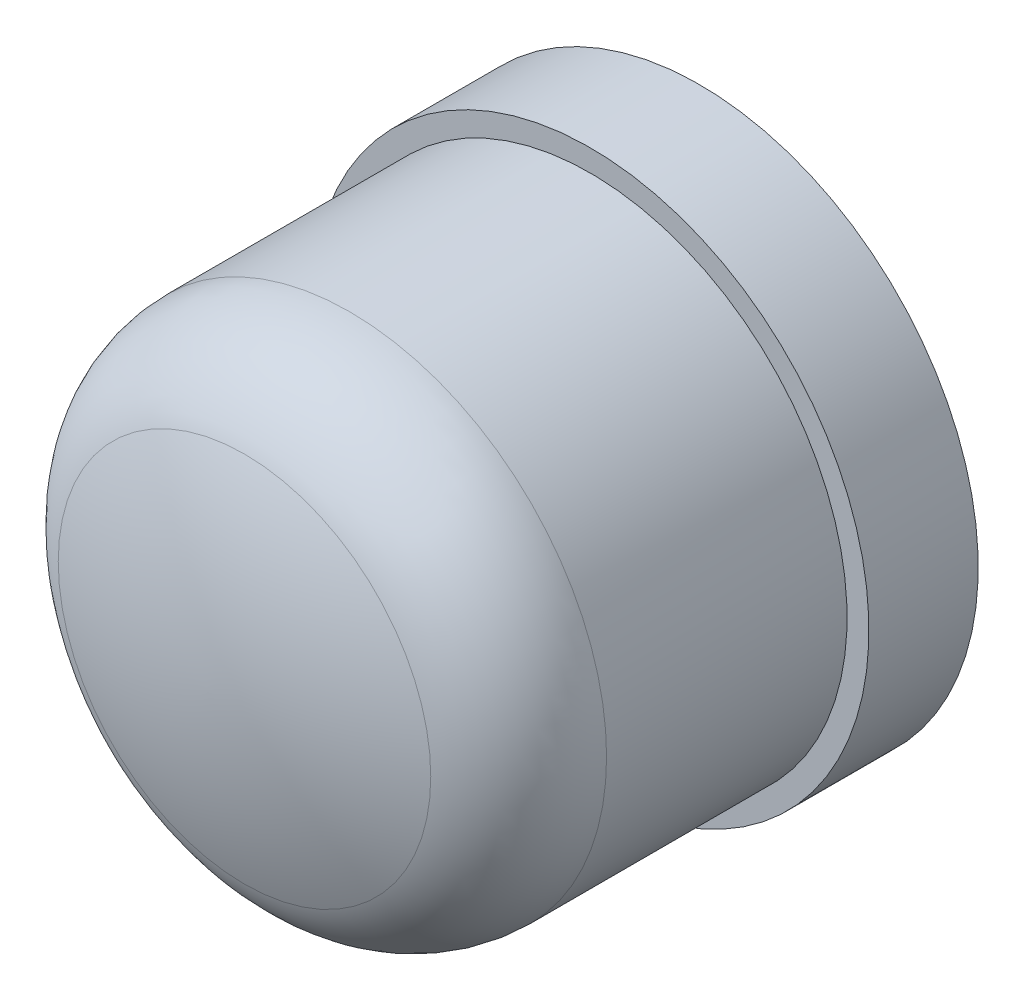
ISO-10303-21;
HEADER;
FILE_DESCRIPTION(('STEP AP214'),'2;1');
FILE_NAME('part.step','',(''),(''),'','','');
FILE_SCHEMA(('AUTOMOTIVE_DESIGN { 1 0 10303 214 1 1 1 1 }'));
ENDSEC;
DATA;
#1=APPLICATION_CONTEXT('core data for automotive mechanical design processes');
#2=APPLICATION_PROTOCOL_DEFINITION('international standard','automotive_design',2000,#1);
#3=PRODUCT_CONTEXT('',#1,'mechanical');
#4=PRODUCT('Part','Part','',(#3));
#5=PRODUCT_RELATED_PRODUCT_CATEGORY('part','',(#4));
#6=PRODUCT_DEFINITION_FORMATION('','',#4);
#7=PRODUCT_DEFINITION_CONTEXT('part definition',#1,'design');
#8=PRODUCT_DEFINITION('design','',#6,#7);
#9=PRODUCT_DEFINITION_SHAPE('','',#8);
#10=(LENGTH_UNIT() NAMED_UNIT(*) SI_UNIT(.MILLI.,.METRE.));
#11=(NAMED_UNIT(*) PLANE_ANGLE_UNIT() SI_UNIT($,.RADIAN.));
#12=(NAMED_UNIT(*) SI_UNIT($,.STERADIAN.) SOLID_ANGLE_UNIT());
#13=UNCERTAINTY_MEASURE_WITH_UNIT(LENGTH_MEASURE(1.E-05),#10,'distance_accuracy_value','');
#14=(GEOMETRIC_REPRESENTATION_CONTEXT(3) GLOBAL_UNCERTAINTY_ASSIGNED_CONTEXT((#13)) GLOBAL_UNIT_ASSIGNED_CONTEXT((#10,
#11,#12)) REPRESENTATION_CONTEXT('',''));
#15=CARTESIAN_POINT('',(0.,0.,0.));
#16=DIRECTION('',(0.,0.,1.));
#17=DIRECTION('',(1.,0.,0.));
#18=AXIS2_PLACEMENT_3D('',#15,#16,#17);
#19=CARTESIAN_POINT('',(-1.5,6.6,15.));
#20=DIRECTION('',(-0.965925826289068,-0.258819045102521,0.));
#21=DIRECTION('',(0.258819045102521,-0.965925826289068,0.));
#22=AXIS2_PLACEMENT_3D('',#19,#20,#21);
#23=PLANE('',#22);
#24=DIRECTION('',(0.258819045102522,-0.965925826289068,0.));
#25=VECTOR('',#24,1.);
#26=CARTESIAN_POINT('',(-1.77135912865659,7.61272605524401,18.052));
#27=LINE('',#26,#25);
#28=CARTESIAN_POINT('',(-1.77135912865659,7.61272605524403,18.052));
#29=VERTEX_POINT('',#28);
#30=CARTESIAN_POINT('',(-1.5,6.6,18.052));
#31=VERTEX_POINT('',#30);
#32=EDGE_CURVE('E180',#29,#31,#27,.T.);
#33=ORIENTED_EDGE('',*,*,#32,.F.);
#34=CARTESIAN_POINT('',(-1.77135912865659,7.61272605524402,18.052));
#35=CARTESIAN_POINT('',(-1.78165605255418,7.65115469839147,17.9774722644857));
#36=CARTESIAN_POINT('',(-1.79113368822193,7.68652571623915,17.9012562079374));
#37=CARTESIAN_POINT('',(-1.80839573763305,7.75094856168421,17.7459755105047));
#38=CARTESIAN_POINT('',(-1.81617944246425,7.77999774358538,17.6669096930647));
#39=CARTESIAN_POINT('',(-1.8299591105371,7.8314241649447,17.5068827660216));
#40=CARTESIAN_POINT('',(-1.8359629858953,7.8538309328238,17.4259318241243));
#41=CARTESIAN_POINT('',(-1.84618565847688,7.89198246628738,17.2624059358982));
#42=CARTESIAN_POINT('',(-1.85040535104523,7.90773057334479,17.1798318259373));
#43=CARTESIAN_POINT('',(-1.85673075051802,7.93133728555541,17.0212053201868));
#44=CARTESIAN_POINT('',(-1.85899438538601,7.93978528589257,16.9452464104373));
#45=CARTESIAN_POINT('',(-1.8620138928105,7.95105424101459,16.7929056633513));
#46=CARTESIAN_POINT('',(-1.8627701327098,7.95387656674146,16.7165239336044));
#47=CARTESIAN_POINT('',(-1.86276891714394,7.95387203018792,16.5327119650491));
#48=CARTESIAN_POINT('',(-1.86127197825863,7.94828537821213,16.4252703859632));
#49=CARTESIAN_POINT('',(-1.8553048956463,7.92601592272994,16.2114628765321));
#50=CARTESIAN_POINT('',(-1.85083025084344,7.9093163209798,16.1050988224475));
#51=CARTESIAN_POINT('',(-1.84487869948727,7.88710482893465,16.0000000000239));
#52=B_SPLINE_CURVE_WITH_KNOTS('',3,(#34,#35,#36,#37,#38,#39,#40,#41,#42,#43,#44,#45,#46,#47,#48,
#49,#50,#51),.UNSPECIFIED.,.F.,.F.,(4,2,2,2,2,2,2,2,4),(0.,0.253368525451175,0.50684288290093,
0.759172931164672,1.0113762035459,1.24053545645671,1.4696388578486,1.79178704609321,
2.11442330038029),.UNSPECIFIED.);
#53=CARTESIAN_POINT('',(-1.84487869949342,7.88710482895773,16.0000000000213));
#54=VERTEX_POINT('',#53);
#55=EDGE_CURVE('E20',#29,#54,#52,.T.);
#56=ORIENTED_EDGE('',*,*,#55,.T.);
#57=DIRECTION('',(0.,0.,1.));
#58=VECTOR('',#57,1.);
#59=CARTESIAN_POINT('',(-1.8448786994871,7.88710482893413,15.));
#60=LINE('',#59,#58);
#61=CARTESIAN_POINT('',(-1.84487869949342,7.88710482895773,15.));
#62=VERTEX_POINT('',#61);
#63=EDGE_CURVE('E158',#54,#62,#60,.F.);
#64=ORIENTED_EDGE('',*,*,#63,.T.);
#65=DIRECTION('',(0.258819045102521,-0.965925826289068,0.));
#66=VECTOR('',#65,1.);
#67=CARTESIAN_POINT('',(-1.5,6.6,15.));
#68=LINE('',#67,#66);
#69=CARTESIAN_POINT('',(-1.5,6.6,15.));
#70=VERTEX_POINT('',#69);
#71=EDGE_CURVE('E168',#62,#70,#68,.T.);
#72=ORIENTED_EDGE('',*,*,#71,.T.);
#73=DIRECTION('',(0.,0.,-1.));
#74=VECTOR('',#73,1.);
#75=CARTESIAN_POINT('',(-1.5,6.6,15.));
#76=LINE('',#75,#74);
#77=EDGE_CURVE('E517',#31,#70,#76,.T.);
#78=ORIENTED_EDGE('',*,*,#77,.F.);
#79=EDGE_LOOP('',(#33,#56,#64,#72,#78));
#80=FACE_BOUND('',#79,.T.);
#81=ADVANCED_FACE('F16',(#80),#23,.T.);
#82=CARTESIAN_POINT('',(2.30384757729337,9.6,15.));
#83=DIRECTION('',(0.965925826289068,-0.258819045102521,0.));
#84=DIRECTION('',(0.258819045102521,0.965925826289068,0.));
#85=AXIS2_PLACEMENT_3D('',#82,#83,#84);
#86=PLANE('',#85);
#87=DIRECTION('',(0.,0.,-1.));
#88=VECTOR('',#87,1.);
#89=CARTESIAN_POINT('',(1.5,6.6,15.));
#90=LINE('',#89,#88);
#91=CARTESIAN_POINT('',(1.5,6.6,15.));
#92=VERTEX_POINT('',#91);
#93=CARTESIAN_POINT('',(1.5,6.6,18.052));
#94=VERTEX_POINT('',#93);
#95=EDGE_CURVE('E520',#92,#94,#90,.F.);
#96=ORIENTED_EDGE('',*,*,#95,.F.);
#97=DIRECTION('',(0.258819045102521,0.965925826289068,0.));
#98=VECTOR('',#97,1.);
#99=CARTESIAN_POINT('',(2.30384757729337,9.6,15.));
#100=LINE('',#99,#98);
#101=CARTESIAN_POINT('',(1.84487869949975,7.88710482898134,15.));
#102=VERTEX_POINT('',#101);
#103=EDGE_CURVE('E528',#92,#102,#100,.T.);
#104=ORIENTED_EDGE('',*,*,#103,.T.);
#105=DIRECTION('',(0.,0.,1.));
#106=VECTOR('',#105,1.);
#107=CARTESIAN_POINT('',(1.84487869949975,7.88710482898134,15.));
#108=LINE('',#107,#106);
#109=CARTESIAN_POINT('',(1.84487869949349,7.88710482895799,16.0000000000226));
#110=VERTEX_POINT('',#109);
#111=EDGE_CURVE('E182',#102,#110,#108,.T.);
#112=ORIENTED_EDGE('',*,*,#111,.T.);
#113=CARTESIAN_POINT('',(1.84487869948724,7.88710482893465,16.0000000000239));
#114=CARTESIAN_POINT('',(1.85081788201614,7.90927015988792,16.1049479226685));
#115=CARTESIAN_POINT('',(1.85528765578418,7.92595158268859,16.2110912734846));
#116=CARTESIAN_POINT('',(1.86126709153423,7.94826714070837,16.424850545869));
#117=CARTESIAN_POINT('',(1.8627702641768,7.95387705738298,16.5324691783047));
#118=CARTESIAN_POINT('',(1.86276863053825,7.95387096056094,16.8087216999609));
#119=CARTESIAN_POINT('',(1.8590800501704,7.94010499122032,16.9774177244521));
#120=CARTESIAN_POINT('',(1.84441641157109,7.88537954694384,17.3099373151076));
#121=CARTESIAN_POINT('',(1.8334459382706,7.84443718320336,17.4737638794823));
#122=CARTESIAN_POINT('',(1.8124633829864,7.76612922081008,17.704903006199));
#123=CARTESIAN_POINT('',(1.80519750127964,7.73901258111869,17.776080305741));
#124=CARTESIAN_POINT('',(1.78929554222692,7.67966566199406,17.9159493810354));
#125=CARTESIAN_POINT('',(1.78066211825283,7.64744528507947,17.9846456599771));
#126=CARTESIAN_POINT('',(1.7713591286566,7.61272605524403,18.052));
#127=B_SPLINE_CURVE_WITH_KNOTS('',3,(#113,#114,#115,#116,#117,#118,#119,#120,#121,#122,#123,
#124,#125,#126),.UNSPECIFIED.,.F.,.F.,(4,2,2,2,2,2,4),(0.,0.322040383444045,0.644784441930393,
1.15018160192491,1.65526084790118,1.88461227576194,2.11352403602894),.UNSPECIFIED.);
#128=CARTESIAN_POINT('',(1.77135912865659,7.61272605524403,18.052));
#129=VERTEX_POINT('',#128);
#130=EDGE_CURVE('E184',#110,#129,#127,.T.);
#131=ORIENTED_EDGE('',*,*,#130,.T.);
#132=DIRECTION('',(0.258819045102522,0.965925826289068,0.));
#133=VECTOR('',#132,1.);
#134=CARTESIAN_POINT('',(1.5,6.6,18.052));
#135=LINE('',#134,#133);
#136=EDGE_CURVE('E538',#94,#129,#135,.T.);
#137=ORIENTED_EDGE('',*,*,#136,.F.);
#138=EDGE_LOOP('',(#96,#104,#112,#131,#137));
#139=FACE_BOUND('',#138,.T.);
#140=ADVANCED_FACE('F536',(#139),#86,.T.);
#141=CARTESIAN_POINT('',(0.,8.27450475901578,18.052));
#142=DIRECTION('',(0.,0.,1.));
#143=DIRECTION('',(1.,0.,0.));
#144=AXIS2_PLACEMENT_3D('',#141,#142,#143);
#145=PLANE('',#144);
#146=DIRECTION('',(1.,0.,0.));
#147=VECTOR('',#146,1.);
#148=CARTESIAN_POINT('',(0.,6.6,18.052));
#149=LINE('',#148,#147);
#150=EDGE_CURVE('E426',#94,#31,#149,.F.);
#151=ORIENTED_EDGE('',*,*,#150,.F.);
#152=ORIENTED_EDGE('',*,*,#136,.T.);
#153=CARTESIAN_POINT('',(0.,0.,18.052));
#154=DIRECTION('',(0.,0.,1.));
#155=DIRECTION('',(1.,0.,0.));
#156=AXIS2_PLACEMENT_3D('',#153,#154,#155);
#157=CIRCLE('',#156,7.8160930876536);
#158=EDGE_CURVE('E304',#129,#29,#157,.T.);
#159=ORIENTED_EDGE('',*,*,#158,.T.);
#160=ORIENTED_EDGE('',*,*,#32,.T.);
#161=EDGE_LOOP('',(#151,#152,#159,#160));
#162=FACE_BOUND('',#161,.T.);
#163=ADVANCED_FACE('F331',(#162),#145,.T.);
#164=CARTESIAN_POINT('',(6.6,1.5,15.));
#165=DIRECTION('',(-0.258819045102521,0.965925826289068,0.));
#166=DIRECTION('',(-0.965925826289068,-0.258819045102521,0.));
#167=AXIS2_PLACEMENT_3D('',#164,#165,#166);
#168=PLANE('',#167);
#169=CARTESIAN_POINT('',(7.61272605524402,1.77135912865659,18.052));
#170=CARTESIAN_POINT('',(7.65115469839147,1.78165605255418,17.9774722644857));
#171=CARTESIAN_POINT('',(7.68652571623915,1.79113368822193,17.9012562079375));
#172=CARTESIAN_POINT('',(7.75094856168421,1.80839573763305,17.7459755105047));
#173=CARTESIAN_POINT('',(7.77999774358538,1.81617944246425,17.6669096930647));
#174=CARTESIAN_POINT('',(7.8314241649447,1.8299591105371,17.5068827660216));
#175=CARTESIAN_POINT('',(7.8538309328238,1.8359629858953,17.4259318241243));
#176=CARTESIAN_POINT('',(7.89198246628738,1.84618565847687,17.2624059358982));
#177=CARTESIAN_POINT('',(7.9077305733448,1.85040535104523,17.1798318259373));
#178=CARTESIAN_POINT('',(7.93133728555541,1.85673075051802,17.0212053201868));
#179=CARTESIAN_POINT('',(7.93978528589256,1.85899438538601,16.9452464104373));
#180=CARTESIAN_POINT('',(7.95105424101459,1.8620138928105,16.7929056633513));
#181=CARTESIAN_POINT('',(7.95387656674146,1.8627701327098,16.7165239336044));
#182=CARTESIAN_POINT('',(7.95387203018792,1.86276891714394,16.5327119650491));
#183=CARTESIAN_POINT('',(7.94828537821213,1.86127197825863,16.4252703859632));
#184=CARTESIAN_POINT('',(7.92601592272994,1.8553048956463,16.2114628765321));
#185=CARTESIAN_POINT('',(7.9093163209798,1.85083025084344,16.1050988224475));
#186=CARTESIAN_POINT('',(7.88710482893465,1.84487869948727,16.0000000000239));
#187=B_SPLINE_CURVE_WITH_KNOTS('',3,(#169,#170,#171,#172,#173,#174,#175,#176,#177,#178,#179,
#180,#181,#182,#183,#184,#185,#186),.UNSPECIFIED.,.F.,.F.,(4,2,2,2,2,2,2,2,4),(0.,
0.253368525451172,0.50684288290093,0.759172931164676,1.0113762035459,1.24053545645671,
1.4696388578486,1.79178704609322,2.11442330038029),.UNSPECIFIED.);
#188=CARTESIAN_POINT('',(7.61272605524402,1.77135912865659,18.052));
#189=VERTEX_POINT('',#188);
#190=CARTESIAN_POINT('',(7.88710482895773,1.84487869949342,16.0000000000213));
#191=VERTEX_POINT('',#190);
#192=EDGE_CURVE('E334',#189,#191,#187,.T.);
#193=ORIENTED_EDGE('',*,*,#192,.T.);
#194=DIRECTION('',(0.,0.,1.));
#195=VECTOR('',#194,1.);
#196=CARTESIAN_POINT('',(7.88710482893413,1.8448786994871,15.));
#197=LINE('',#196,#195);
#198=CARTESIAN_POINT('',(7.88710482895773,1.84487869949342,15.));
#199=VERTEX_POINT('',#198);
#200=EDGE_CURVE('E512',#191,#199,#197,.F.);
#201=ORIENTED_EDGE('',*,*,#200,.T.);
#202=DIRECTION('',(-0.965925826289068,-0.258819045102521,0.));
#203=VECTOR('',#202,1.);
#204=CARTESIAN_POINT('',(6.6,1.5,15.));
#205=LINE('',#204,#203);
#206=CARTESIAN_POINT('',(6.6,1.5,15.));
#207=VERTEX_POINT('',#206);
#208=EDGE_CURVE('E510',#199,#207,#205,.T.);
#209=ORIENTED_EDGE('',*,*,#208,.T.);
#210=DIRECTION('',(0.,0.,1.));
#211=VECTOR('',#210,1.);
#212=CARTESIAN_POINT('',(6.6,1.5,15.));
#213=LINE('',#212,#211);
#214=CARTESIAN_POINT('',(6.6,1.5,18.052));
#215=VERTEX_POINT('',#214);
#216=EDGE_CURVE('E460',#215,#207,#213,.F.);
#217=ORIENTED_EDGE('',*,*,#216,.F.);
#218=DIRECTION('',(-0.965925826289068,-0.258819045102522,0.));
#219=VECTOR('',#218,1.);
#220=CARTESIAN_POINT('',(7.61272605524401,1.77135912865659,18.052));
#221=LINE('',#220,#219);
#222=EDGE_CURVE('E566',#189,#215,#221,.T.);
#223=ORIENTED_EDGE('',*,*,#222,.F.);
#224=EDGE_LOOP('',(#193,#201,#209,#217,#223));
#225=FACE_BOUND('',#224,.T.);
#226=ADVANCED_FACE('F326',(#225),#168,.T.);
#227=CARTESIAN_POINT('',(9.6,-2.30384757729337,15.));
#228=DIRECTION('',(-0.258819045102521,-0.965925826289068,0.));
#229=DIRECTION('',(0.965925826289068,-0.258819045102521,0.));
#230=AXIS2_PLACEMENT_3D('',#227,#228,#229);
#231=PLANE('',#230);
#232=DIRECTION('',(0.,0.,1.));
#233=VECTOR('',#232,1.);
#234=CARTESIAN_POINT('',(6.6,-1.5,15.));
#235=LINE('',#234,#233);
#236=CARTESIAN_POINT('',(6.6,-1.5,15.));
#237=VERTEX_POINT('',#236);
#238=CARTESIAN_POINT('',(6.6,-1.5,18.052));
#239=VERTEX_POINT('',#238);
#240=EDGE_CURVE('E463',#237,#239,#235,.T.);
#241=ORIENTED_EDGE('',*,*,#240,.F.);
#242=DIRECTION('',(0.965925826289068,-0.258819045102521,0.));
#243=VECTOR('',#242,1.);
#244=CARTESIAN_POINT('',(9.6,-2.30384757729337,15.));
#245=LINE('',#244,#243);
#246=CARTESIAN_POINT('',(7.88710482898134,-1.84487869949975,15.));
#247=VERTEX_POINT('',#246);
#248=EDGE_CURVE('E317',#237,#247,#245,.T.);
#249=ORIENTED_EDGE('',*,*,#248,.T.);
#250=DIRECTION('',(0.,0.,1.));
#251=VECTOR('',#250,1.);
#252=CARTESIAN_POINT('',(7.88710482898134,-1.84487869949975,15.));
#253=LINE('',#252,#251);
#254=CARTESIAN_POINT('',(7.88710482895799,-1.8448786994935,16.0000000000226));
#255=VERTEX_POINT('',#254);
#256=EDGE_CURVE('E318',#247,#255,#253,.T.);
#257=ORIENTED_EDGE('',*,*,#256,.T.);
#258=CARTESIAN_POINT('',(7.88710482893465,-1.84487869948724,16.0000000000239));
#259=CARTESIAN_POINT('',(7.90927015988792,-1.85081788201613,16.1049479226685));
#260=CARTESIAN_POINT('',(7.9259515826886,-1.85528765578418,16.2110912734846));
#261=CARTESIAN_POINT('',(7.94826714070837,-1.86126709153423,16.424850545869));
#262=CARTESIAN_POINT('',(7.95387705738298,-1.8627702641768,16.5324691783047));
#263=CARTESIAN_POINT('',(7.95387096056094,-1.86276863053826,16.8087216999609));
#264=CARTESIAN_POINT('',(7.94010499122032,-1.8590800501704,16.9774177244521));
#265=CARTESIAN_POINT('',(7.88537954694384,-1.84441641157109,17.3099373151076));
#266=CARTESIAN_POINT('',(7.84443718320336,-1.83344593827061,17.4737638794823));
#267=CARTESIAN_POINT('',(7.76612922081008,-1.8124633829864,17.704903006199));
#268=CARTESIAN_POINT('',(7.73901258111869,-1.80519750127965,17.776080305741));
#269=CARTESIAN_POINT('',(7.67966566199406,-1.78929554222692,17.9159493810354));
#270=CARTESIAN_POINT('',(7.64744528507947,-1.78066211825283,17.9846456599771));
#271=CARTESIAN_POINT('',(7.61272605524403,-1.77135912865659,18.052));
#272=B_SPLINE_CURVE_WITH_KNOTS('',3,(#258,#259,#260,#261,#262,#263,#264,#265,#266,#267,#268,
#269,#270,#271),.UNSPECIFIED.,.F.,.F.,(4,2,2,2,2,2,4),(0.,0.322040383444045,0.644784441930394,
1.15018160192491,1.65526084790118,1.88461227576194,2.11352403602894),.UNSPECIFIED.);
#273=CARTESIAN_POINT('',(7.61272605524403,-1.77135912865659,18.052));
#274=VERTEX_POINT('',#273);
#275=EDGE_CURVE('E313',#255,#274,#272,.T.);
#276=ORIENTED_EDGE('',*,*,#275,.T.);
#277=DIRECTION('',(0.965925826289068,-0.258819045102522,0.));
#278=VECTOR('',#277,1.);
#279=CARTESIAN_POINT('',(6.6,-1.5,18.052));
#280=LINE('',#279,#278);
#281=EDGE_CURVE('E265',#239,#274,#280,.T.);
#282=ORIENTED_EDGE('',*,*,#281,.F.);
#283=EDGE_LOOP('',(#241,#249,#257,#276,#282));
#284=FACE_BOUND('',#283,.T.);
#285=ADVANCED_FACE('F322',(#284),#231,.T.);
#286=CARTESIAN_POINT('',(1.5,-6.6,15.));
#287=DIRECTION('',(0.965925826289068,0.258819045102521,0.));
#288=DIRECTION('',(-0.258819045102521,0.965925826289068,0.));
#289=AXIS2_PLACEMENT_3D('',#286,#287,#288);
#290=PLANE('',#289);
#291=DIRECTION('',(-0.258819045102522,0.965925826289068,0.));
#292=VECTOR('',#291,1.);
#293=CARTESIAN_POINT('',(1.77135912865659,-7.61272605524401,18.052));
#294=LINE('',#293,#292);
#295=CARTESIAN_POINT('',(1.7713591286566,-7.61272605524403,18.052));
#296=VERTEX_POINT('',#295);
#297=CARTESIAN_POINT('',(1.5,-6.6,18.052));
#298=VERTEX_POINT('',#297);
#299=EDGE_CURVE('E489',#296,#298,#294,.T.);
#300=ORIENTED_EDGE('',*,*,#299,.F.);
#301=CARTESIAN_POINT('',(1.7713591286566,-7.61272605524402,18.052));
#302=CARTESIAN_POINT('',(1.78165605255418,-7.65115469839147,17.9774722644857));
#303=CARTESIAN_POINT('',(1.79113368822193,-7.68652571623915,17.9012562079374));
#304=CARTESIAN_POINT('',(1.80839573763305,-7.75094856168421,17.7459755105047));
#305=CARTESIAN_POINT('',(1.81617944246425,-7.77999774358538,17.6669096930647));
#306=CARTESIAN_POINT('',(1.8299591105371,-7.8314241649447,17.5068827660216));
#307=CARTESIAN_POINT('',(1.8359629858953,-7.8538309328238,17.4259318241243));
#308=CARTESIAN_POINT('',(1.84618565847687,-7.89198246628738,17.2624059358982));
#309=CARTESIAN_POINT('',(1.85040535104523,-7.9077305733448,17.1798318259373));
#310=CARTESIAN_POINT('',(1.85673075051801,-7.93133728555541,17.0212053201868));
#311=CARTESIAN_POINT('',(1.85899438538601,-7.93978528589256,16.9452464104373));
#312=CARTESIAN_POINT('',(1.8620138928105,-7.95105424101459,16.7929056633513));
#313=CARTESIAN_POINT('',(1.8627701327098,-7.95387656674146,16.7165239336044));
#314=CARTESIAN_POINT('',(1.86276891714394,-7.95387203018792,16.5327119650491));
#315=CARTESIAN_POINT('',(1.86127197825863,-7.94828537821213,16.4252703859632));
#316=CARTESIAN_POINT('',(1.8553048956463,-7.92601592272994,16.2114628765321));
#317=CARTESIAN_POINT('',(1.85083025084344,-7.9093163209798,16.1050988224475));
#318=CARTESIAN_POINT('',(1.84487869948726,-7.88710482893465,16.0000000000239));
#319=B_SPLINE_CURVE_WITH_KNOTS('',3,(#301,#302,#303,#304,#305,#306,#307,#308,#309,#310,#311,
#312,#313,#314,#315,#316,#317,#318),.UNSPECIFIED.,.F.,.F.,(4,2,2,2,2,2,2,2,4),(0.,
0.253368525451174,0.50684288290093,0.759172931164672,1.0113762035459,1.24053545645671,
1.4696388578486,1.79178704609321,2.11442330038029),.UNSPECIFIED.);
#320=CARTESIAN_POINT('',(1.84487869949342,-7.88710482895773,16.0000000000213));
#321=VERTEX_POINT('',#320);
#322=EDGE_CURVE('E306',#296,#321,#319,.T.);
#323=ORIENTED_EDGE('',*,*,#322,.T.);
#324=DIRECTION('',(0.,0.,1.));
#325=VECTOR('',#324,1.);
#326=CARTESIAN_POINT('',(1.8448786994871,-7.88710482893413,15.));
#327=LINE('',#326,#325);
#328=CARTESIAN_POINT('',(1.84487869949342,-7.88710482895773,15.));
#329=VERTEX_POINT('',#328);
#330=EDGE_CURVE('E497',#321,#329,#327,.F.);
#331=ORIENTED_EDGE('',*,*,#330,.T.);
#332=DIRECTION('',(-0.258819045102521,0.965925826289068,0.));
#333=VECTOR('',#332,1.);
#334=CARTESIAN_POINT('',(1.5,-6.6,15.));
#335=LINE('',#334,#333);
#336=CARTESIAN_POINT('',(1.5,-6.6,15.));
#337=VERTEX_POINT('',#336);
#338=EDGE_CURVE('E312',#329,#337,#335,.T.);
#339=ORIENTED_EDGE('',*,*,#338,.T.);
#340=DIRECTION('',(0.,0.,1.));
#341=VECTOR('',#340,1.);
#342=CARTESIAN_POINT('',(1.5,-6.6,15.));
#343=LINE('',#342,#341);
#344=EDGE_CURVE('E475',#298,#337,#343,.F.);
#345=ORIENTED_EDGE('',*,*,#344,.F.);
#346=EDGE_LOOP('',(#300,#323,#331,#339,#345));
#347=FACE_BOUND('',#346,.T.);
#348=ADVANCED_FACE('F291',(#347),#290,.T.);
#349=CARTESIAN_POINT('',(-2.30384757729337,-9.6,15.));
#350=DIRECTION('',(-0.965925826289068,0.258819045102521,0.));
#351=DIRECTION('',(-0.258819045102521,-0.965925826289068,0.));
#352=AXIS2_PLACEMENT_3D('',#349,#350,#351);
#353=PLANE('',#352);
#354=DIRECTION('',(0.,0.,1.));
#355=VECTOR('',#354,1.);
#356=CARTESIAN_POINT('',(-1.5,-6.6,15.));
#357=LINE('',#356,#355);
#358=CARTESIAN_POINT('',(-1.5,-6.6,15.));
#359=VERTEX_POINT('',#358);
#360=CARTESIAN_POINT('',(-1.5,-6.6,18.052));
#361=VERTEX_POINT('',#360);
#362=EDGE_CURVE('E478',#359,#361,#357,.T.);
#363=ORIENTED_EDGE('',*,*,#362,.F.);
#364=DIRECTION('',(-0.258819045102521,-0.965925826289068,0.));
#365=VECTOR('',#364,1.);
#366=CARTESIAN_POINT('',(-2.30384757729337,-9.6,15.));
#367=LINE('',#366,#365);
#368=CARTESIAN_POINT('',(-1.84487869949975,-7.88710482898134,15.));
#369=VERTEX_POINT('',#368);
#370=EDGE_CURVE('E302',#359,#369,#367,.T.);
#371=ORIENTED_EDGE('',*,*,#370,.T.);
#372=DIRECTION('',(0.,0.,1.));
#373=VECTOR('',#372,1.);
#374=CARTESIAN_POINT('',(-1.84487869949975,-7.88710482898134,15.));
#375=LINE('',#374,#373);
#376=CARTESIAN_POINT('',(-1.8448786994935,-7.88710482895799,16.0000000000226));
#377=VERTEX_POINT('',#376);
#378=EDGE_CURVE('E303',#369,#377,#375,.T.);
#379=ORIENTED_EDGE('',*,*,#378,.T.);
#380=CARTESIAN_POINT('',(-1.84487869948724,-7.88710482893465,16.0000000000239));
#381=CARTESIAN_POINT('',(-1.85081788201613,-7.90927015988792,16.1049479226685));
#382=CARTESIAN_POINT('',(-1.85528765578418,-7.9259515826886,16.2110912734846));
#383=CARTESIAN_POINT('',(-1.86126709153423,-7.94826714070837,16.424850545869));
#384=CARTESIAN_POINT('',(-1.8627702641768,-7.95387705738297,16.5324691783047));
#385=CARTESIAN_POINT('',(-1.86276863053826,-7.95387096056094,16.8087216999609));
#386=CARTESIAN_POINT('',(-1.8590800501704,-7.94010499122032,16.9774177244521));
#387=CARTESIAN_POINT('',(-1.84441641157109,-7.88537954694384,17.3099373151076));
#388=CARTESIAN_POINT('',(-1.83344593827061,-7.84443718320336,17.4737638794823));
#389=CARTESIAN_POINT('',(-1.8124633829864,-7.76612922081008,17.704903006199));
#390=CARTESIAN_POINT('',(-1.80519750127964,-7.73901258111869,17.776080305741));
#391=CARTESIAN_POINT('',(-1.78929554222692,-7.67966566199406,17.9159493810354));
#392=CARTESIAN_POINT('',(-1.78066211825283,-7.64744528507947,17.9846456599771));
#393=CARTESIAN_POINT('',(-1.7713591286566,-7.61272605524402,18.052));
#394=B_SPLINE_CURVE_WITH_KNOTS('',3,(#380,#381,#382,#383,#384,#385,#386,#387,#388,#389,#390,
#391,#392,#393),.UNSPECIFIED.,.F.,.F.,(4,2,2,2,2,2,4),(0.,0.322040383444045,0.644784441930393,
1.15018160192491,1.65526084790118,1.88461227576194,2.11352403602894),.UNSPECIFIED.);
#395=CARTESIAN_POINT('',(-1.7713591286566,-7.61272605524403,18.052));
#396=VERTEX_POINT('',#395);
#397=EDGE_CURVE('E296',#377,#396,#394,.T.);
#398=ORIENTED_EDGE('',*,*,#397,.T.);
#399=DIRECTION('',(-0.258819045102522,-0.965925826289068,0.));
#400=VECTOR('',#399,1.);
#401=CARTESIAN_POINT('',(-1.5,-6.6,18.052));
#402=LINE('',#401,#400);
#403=EDGE_CURVE('E561',#361,#396,#402,.T.);
#404=ORIENTED_EDGE('',*,*,#403,.F.);
#405=EDGE_LOOP('',(#363,#371,#379,#398,#404));
#406=FACE_BOUND('',#405,.T.);
#407=ADVANCED_FACE('F286',(#406),#353,.T.);
#408=CARTESIAN_POINT('',(0.,-8.27450475901578,18.052));
#409=DIRECTION('',(0.,0.,1.));
#410=DIRECTION('',(1.,0.,0.));
#411=AXIS2_PLACEMENT_3D('',#408,#409,#410);
#412=PLANE('',#411);
#413=DIRECTION('',(1.,0.,0.));
#414=VECTOR('',#413,1.);
#415=CARTESIAN_POINT('',(0.,-6.6,18.052));
#416=LINE('',#415,#414);
#417=EDGE_CURVE('E466',#361,#298,#416,.T.);
#418=ORIENTED_EDGE('',*,*,#417,.F.);
#419=ORIENTED_EDGE('',*,*,#403,.T.);
#420=CARTESIAN_POINT('',(0.,0.,18.052));
#421=DIRECTION('',(0.,0.,1.));
#422=DIRECTION('',(1.,0.,0.));
#423=AXIS2_PLACEMENT_3D('',#420,#421,#422);
#424=CIRCLE('',#423,7.8160930876536);
#425=EDGE_CURVE('E340',#396,#296,#424,.T.);
#426=ORIENTED_EDGE('',*,*,#425,.T.);
#427=ORIENTED_EDGE('',*,*,#299,.T.);
#428=EDGE_LOOP('',(#418,#419,#426,#427));
#429=FACE_BOUND('',#428,.T.);
#430=ADVANCED_FACE('F282',(#429),#412,.T.);
#431=CARTESIAN_POINT('',(8.27450475901578,0.,18.052));
#432=DIRECTION('',(0.,0.,1.));
#433=DIRECTION('',(1.,0.,0.));
#434=AXIS2_PLACEMENT_3D('',#431,#432,#433);
#435=PLANE('',#434);
#436=ORIENTED_EDGE('',*,*,#281,.T.);
#437=CARTESIAN_POINT('',(0.,0.,18.052));
#438=DIRECTION('',(0.,0.,1.));
#439=DIRECTION('',(1.,0.,0.));
#440=AXIS2_PLACEMENT_3D('',#437,#438,#439);
#441=CIRCLE('',#440,7.8160930876536);
#442=EDGE_CURVE('E269',#274,#189,#441,.T.);
#443=ORIENTED_EDGE('',*,*,#442,.T.);
#444=ORIENTED_EDGE('',*,*,#222,.T.);
#445=DIRECTION('',(0.,1.,0.));
#446=VECTOR('',#445,1.);
#447=CARTESIAN_POINT('',(6.6,0.,18.052));
#448=LINE('',#447,#446);
#449=EDGE_CURVE('E339',#239,#215,#448,.T.);
#450=ORIENTED_EDGE('',*,*,#449,.F.);
#451=EDGE_LOOP('',(#436,#443,#444,#450));
#452=FACE_BOUND('',#451,.T.);
#453=ADVANCED_FACE('F278',(#452),#435,.T.);
#454=CARTESIAN_POINT('',(2.22488760311653,0.,-0.515861620505746));
#455=DIRECTION('',(0.,1.,0.));
#456=DIRECTION('',(1.,0.,0.));
#457=AXIS2_PLACEMENT_3D('',#454,#455,#456);
#458=CIRCLE('',#457,19.9999999999999);
#459=TRIMMED_CURVE('',#458,(PARAMETER_VALUE(-1.68227144153101)),
(PARAMETER_VALUE(1.68227144153101)),.T.,.PARAMETER.);
#460=CARTESIAN_POINT('',(0.,0.,-0.515861620505746));
#461=DIRECTION('',(0.,0.,1.));
#462=AXIS1_PLACEMENT('',#460,#461);
#463=SURFACE_OF_REVOLUTION('',#459,#462);
#464=CARTESIAN_POINT('',(0.,0.,18.8583077251708));
#465=DIRECTION('',(0.,0.,1.));
#466=DIRECTION('',(1.,0.,0.));
#467=AXIS2_PLACEMENT_3D('',#464,#465,#466);
#468=CIRCLE('',#467,7.18891441253554);
#469=CARTESIAN_POINT('',(7.18891441253554,0.,18.8583077251708));
#470=VERTEX_POINT('',#469);
#471=EDGE_CURVE('E266',#470,#470,#468,.F.);
#472=ORIENTED_EDGE('',*,*,#471,.T.);
#473=EDGE_LOOP('',(#472));
#474=FACE_BOUND('',#473,.T.);
#475=CARTESIAN_POINT('',(0.,0.,19.3599999998994));
#476=VERTEX_POINT('',#475);
#477=VERTEX_LOOP('',#476);
#478=FACE_BOUND('',#477,.T.);
#479=ADVANCED_FACE('F274',(#474,#478),#463,.T.);
#480=CARTESIAN_POINT('',(-8.27450475901578,0.,18.052));
#481=DIRECTION('',(0.,0.,1.));
#482=DIRECTION('',(1.,0.,0.));
#483=AXIS2_PLACEMENT_3D('',#480,#481,#482);
#484=PLANE('',#483);
#485=DIRECTION('',(-0.965925826289068,0.258819045102521,0.));
#486=VECTOR('',#485,1.);
#487=CARTESIAN_POINT('',(-9.6,2.30384757729337,18.052));
#488=LINE('',#487,#486);
#489=CARTESIAN_POINT('',(-7.61272605524402,1.77135912865659,18.052));
#490=VERTEX_POINT('',#489);
#491=CARTESIAN_POINT('',(-6.6,1.5,18.052));
#492=VERTEX_POINT('',#491);
#493=EDGE_CURVE('E248',#490,#492,#488,.F.);
#494=ORIENTED_EDGE('',*,*,#493,.F.);
#495=CARTESIAN_POINT('',(0.,0.,18.052));
#496=DIRECTION('',(0.,0.,1.));
#497=DIRECTION('',(1.,0.,0.));
#498=AXIS2_PLACEMENT_3D('',#495,#496,#497);
#499=CIRCLE('',#498,7.8160930876536);
#500=CARTESIAN_POINT('',(-7.61272605524402,-1.77135912865659,18.052));
#501=VERTEX_POINT('',#500);
#502=EDGE_CURVE('E226',#490,#501,#499,.T.);
#503=ORIENTED_EDGE('',*,*,#502,.T.);
#504=DIRECTION('',(0.965925826289068,0.258819045102521,0.));
#505=VECTOR('',#504,1.);
#506=CARTESIAN_POINT('',(-6.6,-1.5,18.052));
#507=LINE('',#506,#505);
#508=CARTESIAN_POINT('',(-6.6,-1.5,18.052));
#509=VERTEX_POINT('',#508);
#510=EDGE_CURVE('E256',#509,#501,#507,.F.);
#511=ORIENTED_EDGE('',*,*,#510,.F.);
#512=DIRECTION('',(0.,1.,0.));
#513=VECTOR('',#512,1.);
#514=CARTESIAN_POINT('',(-6.6,0.,18.052));
#515=LINE('',#514,#513);
#516=EDGE_CURVE('E225',#492,#509,#515,.F.);
#517=ORIENTED_EDGE('',*,*,#516,.F.);
#518=EDGE_LOOP('',(#494,#503,#511,#517));
#519=FACE_BOUND('',#518,.T.);
#520=ADVANCED_FACE('F277',(#519),#484,.T.);
#521=CARTESIAN_POINT('',(-6.6,-1.5,15.));
#522=DIRECTION('',(0.258819045102521,-0.965925826289068,0.));
#523=DIRECTION('',(0.965925826289068,0.258819045102521,0.));
#524=AXIS2_PLACEMENT_3D('',#521,#522,#523);
#525=PLANE('',#524);
#526=CARTESIAN_POINT('',(-7.61272605524402,-1.77135912865659,18.052));
#527=CARTESIAN_POINT('',(-7.65115469839147,-1.78165605255418,17.9774722644857));
#528=CARTESIAN_POINT('',(-7.68652571623915,-1.79113368822193,17.9012562079375));
#529=CARTESIAN_POINT('',(-7.75094856168421,-1.80839573763305,17.7459755105047));
#530=CARTESIAN_POINT('',(-7.77999774358538,-1.81617944246425,17.6669096930647));
#531=CARTESIAN_POINT('',(-7.8314241649447,-1.8299591105371,17.5068827660216));
#532=CARTESIAN_POINT('',(-7.8538309328238,-1.8359629858953,17.4259318241243));
#533=CARTESIAN_POINT('',(-7.89198246628738,-1.84618565847687,17.2624059358982));
#534=CARTESIAN_POINT('',(-7.9077305733448,-1.85040535104523,17.1798318259373));
#535=CARTESIAN_POINT('',(-7.93133728555541,-1.85673075051802,17.0212053201868));
#536=CARTESIAN_POINT('',(-7.93978528589256,-1.85899438538601,16.9452464104373));
#537=CARTESIAN_POINT('',(-7.95105424101459,-1.8620138928105,16.7929056633513));
#538=CARTESIAN_POINT('',(-7.95387656674146,-1.8627701327098,16.7165239336044));
#539=CARTESIAN_POINT('',(-7.95387203018792,-1.86276891714394,16.5327119650491));
#540=CARTESIAN_POINT('',(-7.94828537821213,-1.86127197825863,16.4252703859632));
#541=CARTESIAN_POINT('',(-7.92601592272994,-1.8553048956463,16.2114628765321));
#542=CARTESIAN_POINT('',(-7.9093163209798,-1.85083025084344,16.1050988224475));
#543=CARTESIAN_POINT('',(-7.88710482893465,-1.84487869948727,16.0000000000239));
#544=B_SPLINE_CURVE_WITH_KNOTS('',3,(#526,#527,#528,#529,#530,#531,#532,#533,#534,#535,#536,
#537,#538,#539,#540,#541,#542,#543),.UNSPECIFIED.,.F.,.F.,(4,2,2,2,2,2,2,2,4),(0.,
0.253368525451172,0.50684288290093,0.759172931164676,1.0113762035459,1.24053545645672,
1.4696388578486,1.79178704609322,2.11442330038029),.UNSPECIFIED.);
#545=CARTESIAN_POINT('',(-7.88710482895773,-1.84487869949342,16.0000000000213));
#546=VERTEX_POINT('',#545);
#547=EDGE_CURVE('E219',#501,#546,#544,.T.);
#548=ORIENTED_EDGE('',*,*,#547,.T.);
#549=DIRECTION('',(0.,0.,1.));
#550=VECTOR('',#549,1.);
#551=CARTESIAN_POINT('',(-7.88710482893413,-1.8448786994871,15.));
#552=LINE('',#551,#550);
#553=CARTESIAN_POINT('',(-7.88710482895773,-1.84487869949342,15.));
#554=VERTEX_POINT('',#553);
#555=EDGE_CURVE('E262',#546,#554,#552,.F.);
#556=ORIENTED_EDGE('',*,*,#555,.T.);
#557=DIRECTION('',(0.965925826289068,0.258819045102521,0.));
#558=VECTOR('',#557,1.);
#559=CARTESIAN_POINT('',(-6.6,-1.5,15.));
#560=LINE('',#559,#558);
#561=CARTESIAN_POINT('',(-6.6,-1.5,15.));
#562=VERTEX_POINT('',#561);
#563=EDGE_CURVE('E259',#554,#562,#560,.T.);
#564=ORIENTED_EDGE('',*,*,#563,.T.);
#565=DIRECTION('',(0.,0.,-1.));
#566=VECTOR('',#565,1.);
#567=CARTESIAN_POINT('',(-6.6,-1.5,15.));
#568=LINE('',#567,#566);
#569=EDGE_CURVE('E433',#509,#562,#568,.T.);
#570=ORIENTED_EDGE('',*,*,#569,.F.);
#571=ORIENTED_EDGE('',*,*,#510,.T.);
#572=EDGE_LOOP('',(#548,#556,#564,#570,#571));
#573=FACE_BOUND('',#572,.T.);
#574=ADVANCED_FACE('F228',(#573),#525,.T.);
#575=CARTESIAN_POINT('',(-9.6,2.30384757729337,15.));
#576=DIRECTION('',(0.258819045102521,0.965925826289068,0.));
#577=DIRECTION('',(-0.965925826289068,0.258819045102521,0.));
#578=AXIS2_PLACEMENT_3D('',#575,#576,#577);
#579=PLANE('',#578);
#580=DIRECTION('',(0.,0.,-1.));
#581=VECTOR('',#580,1.);
#582=CARTESIAN_POINT('',(-6.6,1.5,15.));
#583=LINE('',#582,#581);
#584=CARTESIAN_POINT('',(-6.6,1.5,15.));
#585=VERTEX_POINT('',#584);
#586=EDGE_CURVE('E429',#585,#492,#583,.F.);
#587=ORIENTED_EDGE('',*,*,#586,.F.);
#588=DIRECTION('',(-0.965925826289068,0.258819045102521,0.));
#589=VECTOR('',#588,1.);
#590=CARTESIAN_POINT('',(-9.6,2.30384757729337,15.));
#591=LINE('',#590,#589);
#592=CARTESIAN_POINT('',(-7.88710482898134,1.84487869949975,15.));
#593=VERTEX_POINT('',#592);
#594=EDGE_CURVE('E251',#585,#593,#591,.T.);
#595=ORIENTED_EDGE('',*,*,#594,.T.);
#596=DIRECTION('',(0.,0.,1.));
#597=VECTOR('',#596,1.);
#598=CARTESIAN_POINT('',(-7.88710482898134,1.84487869949975,15.));
#599=LINE('',#598,#597);
#600=CARTESIAN_POINT('',(-7.887104828958,1.84487869949349,16.0000000000226));
#601=VERTEX_POINT('',#600);
#602=EDGE_CURVE('E252',#593,#601,#599,.T.);
#603=ORIENTED_EDGE('',*,*,#602,.T.);
#604=CARTESIAN_POINT('',(-7.88710482893465,1.84487869948724,16.0000000000239));
#605=CARTESIAN_POINT('',(-7.90927015988792,1.85081788201613,16.1049479226685));
#606=CARTESIAN_POINT('',(-7.9259515826886,1.85528765578418,16.2110912734846));
#607=CARTESIAN_POINT('',(-7.94826714070837,1.86126709153423,16.424850545869));
#608=CARTESIAN_POINT('',(-7.95387705738298,1.8627702641768,16.5324691783047));
#609=CARTESIAN_POINT('',(-7.95387096056093,1.86276863053826,16.8087216999609));
#610=CARTESIAN_POINT('',(-7.94010499122032,1.8590800501704,16.9774177244521));
#611=CARTESIAN_POINT('',(-7.88537954694384,1.84441641157109,17.3099373151076));
#612=CARTESIAN_POINT('',(-7.84443718320336,1.8334459382706,17.4737638794823));
#613=CARTESIAN_POINT('',(-7.76612922081008,1.8124633829864,17.704903006199));
#614=CARTESIAN_POINT('',(-7.73901258111869,1.80519750127964,17.776080305741));
#615=CARTESIAN_POINT('',(-7.67966566199406,1.78929554222692,17.9159493810354));
#616=CARTESIAN_POINT('',(-7.64744528507947,1.78066211825283,17.9846456599771));
#617=CARTESIAN_POINT('',(-7.61272605524403,1.77135912865659,18.052));
#618=B_SPLINE_CURVE_WITH_KNOTS('',3,(#604,#605,#606,#607,#608,#609,#610,#611,#612,#613,#614,
#615,#616,#617),.UNSPECIFIED.,.F.,.F.,(4,2,2,2,2,2,4),(0.,0.322040383444045,0.644784441930393,
1.15018160192491,1.65526084790118,1.88461227576194,2.11352403602894),.UNSPECIFIED.);
#619=EDGE_CURVE('E176',#601,#490,#618,.T.);
#620=ORIENTED_EDGE('',*,*,#619,.T.);
#621=ORIENTED_EDGE('',*,*,#493,.T.);
#622=EDGE_LOOP('',(#587,#595,#603,#620,#621));
#623=FACE_BOUND('',#622,.T.);
#624=ADVANCED_FACE('F344',(#623),#579,.T.);
#625=CARTESIAN_POINT('',(0.,6.6,15.));
#626=DIRECTION('',(0.,-1.,0.));
#627=DIRECTION('',(0.,0.,-1.));
#628=AXIS2_PLACEMENT_3D('',#625,#626,#627);
#629=PLANE('',#628);
#630=DIRECTION('',(1.,0.,0.));
#631=VECTOR('',#630,1.);
#632=CARTESIAN_POINT('',(0.,6.6,15.));
#633=LINE('',#632,#631);
#634=EDGE_CURVE('E432',#70,#92,#633,.T.);
#635=ORIENTED_EDGE('',*,*,#634,.T.);
#636=ORIENTED_EDGE('',*,*,#95,.T.);
#637=ORIENTED_EDGE('',*,*,#150,.T.);
#638=ORIENTED_EDGE('',*,*,#77,.T.);
#639=EDGE_LOOP('',(#635,#636,#637,#638));
#640=FACE_BOUND('',#639,.T.);
#641=ADVANCED_FACE('F348',(#640),#629,.T.);
#642=CARTESIAN_POINT('',(6.6,0.,15.));
#643=DIRECTION('',(-1.,0.,0.));
#644=DIRECTION('',(0.,0.,1.));
#645=AXIS2_PLACEMENT_3D('',#642,#643,#644);
#646=PLANE('',#645);
#647=DIRECTION('',(0.,1.,0.));
#648=VECTOR('',#647,1.);
#649=CARTESIAN_POINT('',(6.6,0.,15.));
#650=LINE('',#649,#648);
#651=EDGE_CURVE('E440',#207,#237,#650,.F.);
#652=ORIENTED_EDGE('',*,*,#651,.T.);
#653=ORIENTED_EDGE('',*,*,#240,.T.);
#654=ORIENTED_EDGE('',*,*,#449,.T.);
#655=ORIENTED_EDGE('',*,*,#216,.T.);
#656=EDGE_LOOP('',(#652,#653,#654,#655));
#657=FACE_BOUND('',#656,.T.);
#658=ADVANCED_FACE('F352',(#657),#646,.T.);
#659=CARTESIAN_POINT('',(0.,-6.6,15.));
#660=DIRECTION('',(0.,1.,0.));
#661=DIRECTION('',(0.,0.,1.));
#662=AXIS2_PLACEMENT_3D('',#659,#660,#661);
#663=PLANE('',#662);
#664=DIRECTION('',(1.,0.,0.));
#665=VECTOR('',#664,1.);
#666=CARTESIAN_POINT('',(0.,-6.6,15.));
#667=LINE('',#666,#665);
#668=EDGE_CURVE('E437',#337,#359,#667,.F.);
#669=ORIENTED_EDGE('',*,*,#668,.T.);
#670=ORIENTED_EDGE('',*,*,#362,.T.);
#671=ORIENTED_EDGE('',*,*,#417,.T.);
#672=ORIENTED_EDGE('',*,*,#344,.T.);
#673=EDGE_LOOP('',(#669,#670,#671,#672));
#674=FACE_BOUND('',#673,.T.);
#675=ADVANCED_FACE('F356',(#674),#663,.T.);
#676=CARTESIAN_POINT('',(-6.6,0.,15.));
#677=DIRECTION('',(1.,0.,0.));
#678=DIRECTION('',(0.,0.,-1.));
#679=AXIS2_PLACEMENT_3D('',#676,#677,#678);
#680=PLANE('',#679);
#681=DIRECTION('',(0.,1.,0.));
#682=VECTOR('',#681,1.);
#683=CARTESIAN_POINT('',(-6.6,0.,15.));
#684=LINE('',#683,#682);
#685=EDGE_CURVE('E177',#562,#585,#684,.T.);
#686=ORIENTED_EDGE('',*,*,#685,.T.);
#687=ORIENTED_EDGE('',*,*,#586,.T.);
#688=ORIENTED_EDGE('',*,*,#516,.T.);
#689=ORIENTED_EDGE('',*,*,#569,.T.);
#690=EDGE_LOOP('',(#686,#687,#688,#689));
#691=FACE_BOUND('',#690,.T.);
#692=ADVANCED_FACE('F360',(#691),#680,.T.);
#693=CARTESIAN_POINT('',(0.,8.27450475901578,15.));
#694=DIRECTION('',(0.,0.,1.));
#695=DIRECTION('',(1.,0.,0.));
#696=AXIS2_PLACEMENT_3D('',#693,#694,#695);
#697=PLANE('',#696);
#698=ORIENTED_EDGE('',*,*,#103,.F.);
#699=ORIENTED_EDGE('',*,*,#634,.F.);
#700=ORIENTED_EDGE('',*,*,#71,.F.);
#701=CARTESIAN_POINT('',(0.,0.,15.));
#702=DIRECTION('',(0.,0.,-1.));
#703=DIRECTION('',(-1.,0.,0.));
#704=AXIS2_PLACEMENT_3D('',#701,#702,#703);
#705=CIRCLE('',#704,8.09999999995115);
#706=EDGE_CURVE('E165',#62,#102,#705,.T.);
#707=ORIENTED_EDGE('',*,*,#706,.T.);
#708=EDGE_LOOP('',(#698,#699,#700,#707));
#709=FACE_BOUND('',#708,.T.);
#710=ADVANCED_FACE('F364',(#709),#697,.F.);
#711=CARTESIAN_POINT('',(8.27450475901578,0.,15.));
#712=DIRECTION('',(0.,0.,1.));
#713=DIRECTION('',(1.,0.,0.));
#714=AXIS2_PLACEMENT_3D('',#711,#712,#713);
#715=PLANE('',#714);
#716=ORIENTED_EDGE('',*,*,#248,.F.);
#717=ORIENTED_EDGE('',*,*,#651,.F.);
#718=ORIENTED_EDGE('',*,*,#208,.F.);
#719=CARTESIAN_POINT('',(0.,0.,15.));
#720=DIRECTION('',(0.,0.,-1.));
#721=DIRECTION('',(-1.,0.,0.));
#722=AXIS2_PLACEMENT_3D('',#719,#720,#721);
#723=CIRCLE('',#722,8.09999999995115);
#724=EDGE_CURVE('E214',#199,#247,#723,.T.);
#725=ORIENTED_EDGE('',*,*,#724,.T.);
#726=EDGE_LOOP('',(#716,#717,#718,#725));
#727=FACE_BOUND('',#726,.T.);
#728=ADVANCED_FACE('F367',(#727),#715,.F.);
#729=CARTESIAN_POINT('',(0.,-8.27450475901578,15.));
#730=DIRECTION('',(0.,0.,1.));
#731=DIRECTION('',(1.,0.,0.));
#732=AXIS2_PLACEMENT_3D('',#729,#730,#731);
#733=PLANE('',#732);
#734=ORIENTED_EDGE('',*,*,#370,.F.);
#735=ORIENTED_EDGE('',*,*,#668,.F.);
#736=ORIENTED_EDGE('',*,*,#338,.F.);
#737=CARTESIAN_POINT('',(0.,0.,15.));
#738=DIRECTION('',(0.,0.,-1.));
#739=DIRECTION('',(-1.,0.,0.));
#740=AXIS2_PLACEMENT_3D('',#737,#738,#739);
#741=CIRCLE('',#740,8.09999999995115);
#742=EDGE_CURVE('E210',#329,#369,#741,.T.);
#743=ORIENTED_EDGE('',*,*,#742,.T.);
#744=EDGE_LOOP('',(#734,#735,#736,#743));
#745=FACE_BOUND('',#744,.T.);
#746=ADVANCED_FACE('F238',(#745),#733,.F.);
#747=CARTESIAN_POINT('',(0.,0.,16.6401305988653));
#748=DIRECTION('',(0.,0.,1.));
#749=DIRECTION('',(1.,0.,0.));
#750=AXIS2_PLACEMENT_3D('',#747,#748,#749);
#751=TOROIDAL_SURFACE('',#750,5.1690901042515,3.00000000000001);
#752=ORIENTED_EDGE('',*,*,#471,.F.);
#753=EDGE_LOOP('',(#752));
#754=FACE_BOUND('',#753,.T.);
#755=ORIENTED_EDGE('',*,*,#397,.F.);
#756=CARTESIAN_POINT('',(0.,0.,16.0000000000213));
#757=DIRECTION('',(0.,0.,-1.));
#758=DIRECTION('',(-1.,0.,0.));
#759=AXIS2_PLACEMENT_3D('',#756,#757,#758);
#760=CIRCLE('',#759,8.09999999995115);
#761=EDGE_CURVE('E209',#377,#546,#760,.T.);
#762=ORIENTED_EDGE('',*,*,#761,.T.);
#763=ORIENTED_EDGE('',*,*,#547,.F.);
#764=ORIENTED_EDGE('',*,*,#502,.F.);
#765=ORIENTED_EDGE('',*,*,#619,.F.);
#766=CARTESIAN_POINT('',(0.,0.,16.0000000000213));
#767=DIRECTION('',(0.,0.,-1.));
#768=DIRECTION('',(-1.,0.,0.));
#769=AXIS2_PLACEMENT_3D('',#766,#767,#768);
#770=CIRCLE('',#769,8.09999999995115);
#771=EDGE_CURVE('E162',#601,#54,#770,.T.);
#772=ORIENTED_EDGE('',*,*,#771,.T.);
#773=ORIENTED_EDGE('',*,*,#55,.F.);
#774=ORIENTED_EDGE('',*,*,#158,.F.);
#775=ORIENTED_EDGE('',*,*,#130,.F.);
#776=CARTESIAN_POINT('',(0.,0.,16.0000000000213));
#777=DIRECTION('',(0.,0.,-1.));
#778=DIRECTION('',(-1.,0.,0.));
#779=AXIS2_PLACEMENT_3D('',#776,#777,#778);
#780=CIRCLE('',#779,8.09999999995115);
#781=EDGE_CURVE('E217',#110,#191,#780,.T.);
#782=ORIENTED_EDGE('',*,*,#781,.T.);
#783=ORIENTED_EDGE('',*,*,#192,.F.);
#784=ORIENTED_EDGE('',*,*,#442,.F.);
#785=ORIENTED_EDGE('',*,*,#275,.F.);
#786=CARTESIAN_POINT('',(0.,0.,16.0000000000213));
#787=DIRECTION('',(0.,0.,-1.));
#788=DIRECTION('',(-1.,0.,0.));
#789=AXIS2_PLACEMENT_3D('',#786,#787,#788);
#790=CIRCLE('',#789,8.09999999995115);
#791=EDGE_CURVE('E213',#255,#321,#790,.T.);
#792=ORIENTED_EDGE('',*,*,#791,.T.);
#793=ORIENTED_EDGE('',*,*,#322,.F.);
#794=ORIENTED_EDGE('',*,*,#425,.F.);
#795=EDGE_LOOP('',(#755,#762,#763,#764,#765,#772,#773,#774,#775,#782,#783,#784,#785,#792,#793,#794));
#796=FACE_BOUND('',#795,.T.);
#797=ADVANCED_FACE('F172',(#754,#796),#751,.F.);
#798=CARTESIAN_POINT('',(-8.27450475901578,0.,15.));
#799=DIRECTION('',(0.,0.,1.));
#800=DIRECTION('',(1.,0.,0.));
#801=AXIS2_PLACEMENT_3D('',#798,#799,#800);
#802=PLANE('',#801);
#803=ORIENTED_EDGE('',*,*,#594,.F.);
#804=ORIENTED_EDGE('',*,*,#685,.F.);
#805=ORIENTED_EDGE('',*,*,#563,.F.);
#806=CARTESIAN_POINT('',(0.,0.,15.));
#807=DIRECTION('',(0.,0.,-1.));
#808=DIRECTION('',(-1.,0.,0.));
#809=AXIS2_PLACEMENT_3D('',#806,#807,#808);
#810=CIRCLE('',#809,8.09999999995115);
#811=EDGE_CURVE('E207',#554,#593,#810,.T.);
#812=ORIENTED_EDGE('',*,*,#811,.T.);
#813=EDGE_LOOP('',(#803,#804,#805,#812));
#814=FACE_BOUND('',#813,.T.);
#815=ADVANCED_FACE('F237',(#814),#802,.F.);
#816=CARTESIAN_POINT('',(0.,0.,10.2000000000107));
#817=DIRECTION('',(0.,0.,-1.));
#818=DIRECTION('',(-1.,0.,0.));
#819=AXIS2_PLACEMENT_3D('',#816,#817,#818);
#820=CYLINDRICAL_SURFACE('',#819,8.09999999995115);
#821=CARTESIAN_POINT('',(0.,0.,4.40000000000022));
#822=DIRECTION('',(0.,0.,1.));
#823=DIRECTION('',(1.,0.,0.));
#824=AXIS2_PLACEMENT_3D('',#821,#822,#823);
#825=CIRCLE('',#824,8.10000000009998);
#826=CARTESIAN_POINT('',(8.10000000009998,0.,4.40000000000022));
#827=VERTEX_POINT('',#826);
#828=EDGE_CURVE('E206',#827,#827,#825,.T.);
#829=ORIENTED_EDGE('',*,*,#828,.F.);
#830=EDGE_LOOP('',(#829));
#831=FACE_BOUND('',#830,.T.);
#832=ORIENTED_EDGE('',*,*,#602,.F.);
#833=ORIENTED_EDGE('',*,*,#811,.F.);
#834=ORIENTED_EDGE('',*,*,#555,.F.);
#835=ORIENTED_EDGE('',*,*,#761,.F.);
#836=ORIENTED_EDGE('',*,*,#378,.F.);
#837=ORIENTED_EDGE('',*,*,#742,.F.);
#838=ORIENTED_EDGE('',*,*,#330,.F.);
#839=ORIENTED_EDGE('',*,*,#791,.F.);
#840=ORIENTED_EDGE('',*,*,#256,.F.);
#841=ORIENTED_EDGE('',*,*,#724,.F.);
#842=ORIENTED_EDGE('',*,*,#200,.F.);
#843=ORIENTED_EDGE('',*,*,#781,.F.);
#844=ORIENTED_EDGE('',*,*,#111,.F.);
#845=ORIENTED_EDGE('',*,*,#706,.F.);
#846=ORIENTED_EDGE('',*,*,#63,.F.);
#847=ORIENTED_EDGE('',*,*,#771,.F.);
#848=EDGE_LOOP('',(#832,#833,#834,#835,#836,#837,#838,#839,#840,#841,#842,#843,#844,#845,#846,#847));
#849=FACE_BOUND('',#848,.T.);
#850=ADVANCED_FACE('F161',(#831,#849),#820,.F.);
#851=CARTESIAN_POINT('',(0.,0.,4.45454004615425));
#852=DIRECTION('',(0.,0.,1.));
#853=DIRECTION('',(1.,0.,0.));
#854=AXIS2_PLACEMENT_3D('',#851,#852,#853);
#855=TOROIDAL_SURFACE('',#854,33.0999405076968,25.0000000000003);
#856=CARTESIAN_POINT('',(0.,0.,0.));
#857=DIRECTION('',(0.,0.,1.));
#858=DIRECTION('',(1.,0.,0.));
#859=AXIS2_PLACEMENT_3D('',#856,#857,#858);
#860=CIRCLE('',#859,8.5000000001016);
#861=CARTESIAN_POINT('',(8.5000000001016,0.,0.));
#862=VERTEX_POINT('',#861);
#863=EDGE_CURVE('E203',#862,#862,#860,.T.);
#864=ORIENTED_EDGE('',*,*,#863,.F.);
#865=EDGE_LOOP('',(#864));
#866=FACE_BOUND('',#865,.T.);
#867=ORIENTED_EDGE('',*,*,#828,.T.);
#868=EDGE_LOOP('',(#867));
#869=FACE_BOUND('',#868,.T.);
#870=ADVANCED_FACE('F405',(#866,#869),#855,.T.);
#871=CARTESIAN_POINT('',(10.625,0.,0.));
#872=DIRECTION('',(0.,0.,-1.));
#873=DIRECTION('',(-1.,0.,0.));
#874=AXIS2_PLACEMENT_3D('',#871,#872,#873);
#875=PLANE('',#874);
#876=ORIENTED_EDGE('',*,*,#863,.T.);
#877=EDGE_LOOP('',(#876));
#878=FACE_BOUND('',#877,.T.);
#879=CARTESIAN_POINT('',(0.,0.,0.));
#880=DIRECTION('',(0.,0.,-1.));
#881=DIRECTION('',(-1.,0.,0.));
#882=AXIS2_PLACEMENT_3D('',#879,#880,#881);
#883=CIRCLE('',#882,12.75);
#884=CARTESIAN_POINT('',(-12.75,0.,0.));
#885=VERTEX_POINT('',#884);
#886=EDGE_CURVE('E200',#885,#885,#883,.F.);
#887=ORIENTED_EDGE('',*,*,#886,.F.);
#888=EDGE_LOOP('',(#887));
#889=FACE_BOUND('',#888,.T.);
#890=ADVANCED_FACE('F401',(#878,#889),#875,.T.);
#891=CARTESIAN_POINT('',(0.,0.,2.5));
#892=DIRECTION('',(0.,0.,-1.));
#893=DIRECTION('',(-1.,0.,0.));
#894=AXIS2_PLACEMENT_3D('',#891,#892,#893);
#895=CYLINDRICAL_SURFACE('',#894,12.75);
#896=CARTESIAN_POINT('',(0.,0.,5.));
#897=DIRECTION('',(0.,0.,-1.));
#898=DIRECTION('',(-1.,0.,0.));
#899=AXIS2_PLACEMENT_3D('',#896,#897,#898);
#900=CIRCLE('',#899,12.75);
#901=CARTESIAN_POINT('',(-12.75,0.,5.));
#902=VERTEX_POINT('',#901);
#903=EDGE_CURVE('E197',#902,#902,#900,.F.);
#904=ORIENTED_EDGE('',*,*,#903,.F.);
#905=EDGE_LOOP('',(#904));
#906=FACE_BOUND('',#905,.T.);
#907=ORIENTED_EDGE('',*,*,#886,.T.);
#908=EDGE_LOOP('',(#907));
#909=FACE_BOUND('',#908,.T.);
#910=ADVANCED_FACE('F398',(#906,#909),#895,.T.);
#911=CARTESIAN_POINT('',(-0.156243242506585,0.,-0.639472510275226));
#912=DIRECTION('',(0.,1.,0.));
#913=DIRECTION('',(1.,0.,0.));
#914=AXIS2_PLACEMENT_3D('',#911,#912,#913);
#915=CIRCLE('',#914,23.1399999999996);
#916=TRIMMED_CURVE('',#915,(PARAMETER_VALUE(-1.56404419067838)),
(PARAMETER_VALUE(1.56404419067838)),.T.,.PARAMETER.);
#917=CARTESIAN_POINT('',(0.,0.,-0.639472510275226));
#918=DIRECTION('',(0.,0.,1.));
#919=AXIS1_PLACEMENT('',#917,#918);
#920=SURFACE_OF_REVOLUTION('',#916,#919);
#921=CARTESIAN_POINT('',(0.,0.,22.4999999998999));
#922=VERTEX_POINT('',#921);
#923=VERTEX_LOOP('',#922);
#924=FACE_BOUND('',#923,.T.);
#925=CARTESIAN_POINT('',(0.,0.,20.8123649225566));
#926=DIRECTION('',(0.,0.,1.));
#927=DIRECTION('',(1.,0.,0.));
#928=AXIS2_PLACEMENT_3D('',#925,#926,#927);
#929=CIRCLE('',#928,8.52006189017163);
#930=CARTESIAN_POINT('',(8.52006189017163,0.,20.8123649225566));
#931=VERTEX_POINT('',#930);
#932=EDGE_CURVE('E196',#931,#931,#929,.F.);
#933=ORIENTED_EDGE('',*,*,#932,.F.);
#934=EDGE_LOOP('',(#933));
#935=FACE_BOUND('',#934,.T.);
#936=ADVANCED_FACE('F395',(#924,#935),#920,.F.);
#937=CARTESIAN_POINT('',(12.25,0.,5.));
#938=DIRECTION('',(0.,0.,1.));
#939=DIRECTION('',(1.,0.,0.));
#940=AXIS2_PLACEMENT_3D('',#937,#938,#939);
#941=PLANE('',#940);
#942=ORIENTED_EDGE('',*,*,#903,.T.);
#943=EDGE_LOOP('',(#942));
#944=FACE_BOUND('',#943,.T.);
#945=CARTESIAN_POINT('',(0.,0.,5.));
#946=DIRECTION('',(0.,0.,-1.));
#947=DIRECTION('',(-1.,0.,0.));
#948=AXIS2_PLACEMENT_3D('',#945,#946,#947);
#949=CIRCLE('',#948,11.75);
#950=CARTESIAN_POINT('',(-11.75,0.,5.));
#951=VERTEX_POINT('',#950);
#952=EDGE_CURVE('E30',#951,#951,#949,.F.);
#953=ORIENTED_EDGE('',*,*,#952,.F.);
#954=EDGE_LOOP('',(#953));
#955=FACE_BOUND('',#954,.T.);
#956=ADVANCED_FACE('F384',(#944,#955),#941,.T.);
#957=CARTESIAN_POINT('',(0.,0.,15.9999999999329));
#958=DIRECTION('',(0.,0.,1.));
#959=DIRECTION('',(1.,0.,0.));
#960=AXIS2_PLACEMENT_3D('',#957,#958,#959);
#961=TOROIDAL_SURFACE('',#960,6.5499999999,5.2);
#962=CARTESIAN_POINT('',(0.,0.,16.));
#963=DIRECTION('',(0.,0.,-1.));
#964=DIRECTION('',(-1.,0.,0.));
#965=AXIS2_PLACEMENT_3D('',#962,#963,#964);
#966=CIRCLE('',#965,11.75);
#967=CARTESIAN_POINT('',(-11.75,0.,16.));
#968=VERTEX_POINT('',#967);
#969=EDGE_CURVE('E10',#968,#968,#966,.T.);
#970=ORIENTED_EDGE('',*,*,#969,.F.);
#971=EDGE_LOOP('',(#970));
#972=FACE_BOUND('',#971,.T.);
#973=ORIENTED_EDGE('',*,*,#932,.T.);
#974=EDGE_LOOP('',(#973));
#975=FACE_BOUND('',#974,.T.);
#976=ADVANCED_FACE('F378',(#972,#975),#961,.T.);
#977=CARTESIAN_POINT('',(0.,0.,10.5));
#978=DIRECTION('',(0.,0.,-1.));
#979=DIRECTION('',(-1.,0.,0.));
#980=AXIS2_PLACEMENT_3D('',#977,#978,#979);
#981=CYLINDRICAL_SURFACE('',#980,11.75);
#982=ORIENTED_EDGE('',*,*,#952,.T.);
#983=EDGE_LOOP('',(#982));
#984=FACE_BOUND('',#983,.T.);
#985=ORIENTED_EDGE('',*,*,#969,.T.);
#986=EDGE_LOOP('',(#985));
#987=FACE_BOUND('',#986,.T.);
#988=ADVANCED_FACE('F376',(#984,#987),#981,.T.);
#989=CLOSED_SHELL('',(#81,#140,#163,#226,#285,#348,#407,#430,#453,#479,#520,#574,#624,#641,#658,
#675,#692,#710,#728,#746,#797,#815,#850,#870,#890,#910,#936,#956,#976,#988));
#990=MANIFOLD_SOLID_BREP('B1',#989);
#991=ADVANCED_BREP_SHAPE_REPRESENTATION('',(#18,#990),#14);
#992=SHAPE_DEFINITION_REPRESENTATION(#9,#991);
ENDSEC;
END-ISO-10303-21;
